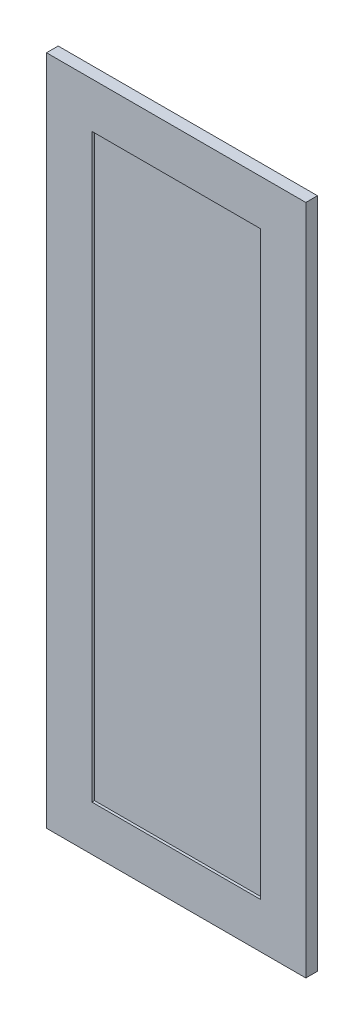
ISO-10303-21;
HEADER;
FILE_DESCRIPTION(('STEP AP214'),'2;1');
FILE_NAME('part.step','',(''),(''),'','','');
FILE_SCHEMA(('AUTOMOTIVE_DESIGN { 1 0 10303 214 1 1 1 1 }'));
ENDSEC;
DATA;
#1=APPLICATION_CONTEXT('core data for automotive mechanical design processes');
#2=APPLICATION_PROTOCOL_DEFINITION('international standard','automotive_design',2000,#1);
#3=PRODUCT_CONTEXT('',#1,'mechanical');
#4=PRODUCT('Part','Part','',(#3));
#5=PRODUCT_RELATED_PRODUCT_CATEGORY('part','',(#4));
#6=PRODUCT_DEFINITION_FORMATION('','',#4);
#7=PRODUCT_DEFINITION_CONTEXT('part definition',#1,'design');
#8=PRODUCT_DEFINITION('design','',#6,#7);
#9=PRODUCT_DEFINITION_SHAPE('','',#8);
#10=(LENGTH_UNIT() NAMED_UNIT(*) SI_UNIT(.MILLI.,.METRE.));
#11=(NAMED_UNIT(*) PLANE_ANGLE_UNIT() SI_UNIT($,.RADIAN.));
#12=(NAMED_UNIT(*) SI_UNIT($,.STERADIAN.) SOLID_ANGLE_UNIT());
#13=UNCERTAINTY_MEASURE_WITH_UNIT(LENGTH_MEASURE(1.E-05),#10,'distance_accuracy_value','');
#14=(GEOMETRIC_REPRESENTATION_CONTEXT(3) GLOBAL_UNCERTAINTY_ASSIGNED_CONTEXT((#13)) GLOBAL_UNIT_ASSIGNED_CONTEXT((#10,
#11,#12)) REPRESENTATION_CONTEXT('',''));
#15=CARTESIAN_POINT('',(0.,0.,0.));
#16=DIRECTION('',(0.,0.,1.));
#17=DIRECTION('',(1.,0.,0.));
#18=AXIS2_PLACEMENT_3D('',#15,#16,#17);
#19=CARTESIAN_POINT('',(200.,518.,18.));
#20=DIRECTION('',(-1.,0.,0.));
#21=DIRECTION('',(0.,-1.,0.));
#22=AXIS2_PLACEMENT_3D('',#19,#20,#21);
#23=PLANE('',#22);
#24=DIRECTION('',(0.,1.,0.));
#25=VECTOR('',#24,1.);
#26=CARTESIAN_POINT('',(200.,518.,0.));
#27=LINE('',#26,#25);
#28=CARTESIAN_POINT('',(200.,-518.,0.));
#29=VERTEX_POINT('',#28);
#30=CARTESIAN_POINT('',(200.,518.,0.));
#31=VERTEX_POINT('',#30);
#32=EDGE_CURVE('E141',#29,#31,#27,.T.);
#33=ORIENTED_EDGE('',*,*,#32,.T.);
#34=DIRECTION('',(0.,0.,-1.));
#35=VECTOR('',#34,1.);
#36=CARTESIAN_POINT('',(200.,518.,18.));
#37=LINE('',#36,#35);
#38=CARTESIAN_POINT('',(200.,518.,18.));
#39=VERTEX_POINT('',#38);
#40=EDGE_CURVE('E11',#39,#31,#37,.T.);
#41=ORIENTED_EDGE('',*,*,#40,.F.);
#42=DIRECTION('',(0.,1.,0.));
#43=VECTOR('',#42,1.);
#44=CARTESIAN_POINT('',(200.,518.,18.));
#45=LINE('',#44,#43);
#46=CARTESIAN_POINT('',(200.,-518.,18.));
#47=VERTEX_POINT('',#46);
#48=EDGE_CURVE('E145',#47,#39,#45,.T.);
#49=ORIENTED_EDGE('',*,*,#48,.F.);
#50=DIRECTION('',(0.,0.,-1.));
#51=VECTOR('',#50,1.);
#52=CARTESIAN_POINT('',(200.,-518.,18.));
#53=LINE('',#52,#51);
#54=EDGE_CURVE('E151',#47,#29,#53,.T.);
#55=ORIENTED_EDGE('',*,*,#54,.T.);
#56=EDGE_LOOP('',(#33,#41,#49,#55));
#57=FACE_BOUND('',#56,.T.);
#58=ADVANCED_FACE('F33',(#57),#23,.F.);
#59=CARTESIAN_POINT('',(-200.,518.,18.));
#60=DIRECTION('',(0.,-1.,0.));
#61=DIRECTION('',(0.,0.,-1.));
#62=AXIS2_PLACEMENT_3D('',#59,#60,#61);
#63=PLANE('',#62);
#64=DIRECTION('',(-1.,0.,0.));
#65=VECTOR('',#64,1.);
#66=CARTESIAN_POINT('',(-200.,518.,0.));
#67=LINE('',#66,#65);
#68=CARTESIAN_POINT('',(-200.,518.,0.));
#69=VERTEX_POINT('',#68);
#70=EDGE_CURVE('E154',#31,#69,#67,.T.);
#71=ORIENTED_EDGE('',*,*,#70,.T.);
#72=DIRECTION('',(0.,0.,-1.));
#73=VECTOR('',#72,1.);
#74=CARTESIAN_POINT('',(-200.,518.,18.));
#75=LINE('',#74,#73);
#76=CARTESIAN_POINT('',(-200.,518.,18.));
#77=VERTEX_POINT('',#76);
#78=EDGE_CURVE('E40',#77,#69,#75,.T.);
#79=ORIENTED_EDGE('',*,*,#78,.F.);
#80=DIRECTION('',(-1.,0.,0.));
#81=VECTOR('',#80,1.);
#82=CARTESIAN_POINT('',(-200.,518.,18.));
#83=LINE('',#82,#81);
#84=EDGE_CURVE('E84',#39,#77,#83,.T.);
#85=ORIENTED_EDGE('',*,*,#84,.F.);
#86=ORIENTED_EDGE('',*,*,#40,.T.);
#87=EDGE_LOOP('',(#71,#79,#85,#86));
#88=FACE_BOUND('',#87,.T.);
#89=ADVANCED_FACE('F183',(#88),#63,.F.);
#90=CARTESIAN_POINT('',(-200.,518.,18.));
#91=DIRECTION('',(1.,0.,0.));
#92=DIRECTION('',(0.,1.,0.));
#93=AXIS2_PLACEMENT_3D('',#90,#91,#92);
#94=PLANE('',#93);
#95=DIRECTION('',(0.,-1.,0.));
#96=VECTOR('',#95,1.);
#97=CARTESIAN_POINT('',(-200.,518.,0.));
#98=LINE('',#97,#96);
#99=CARTESIAN_POINT('',(-200.,-518.,0.));
#100=VERTEX_POINT('',#99);
#101=EDGE_CURVE('E156',#69,#100,#98,.T.);
#102=ORIENTED_EDGE('',*,*,#101,.T.);
#103=DIRECTION('',(0.,0.,-1.));
#104=VECTOR('',#103,1.);
#105=CARTESIAN_POINT('',(-200.,-518.,18.));
#106=LINE('',#105,#104);
#107=CARTESIAN_POINT('',(-200.,-518.,18.));
#108=VERTEX_POINT('',#107);
#109=EDGE_CURVE('E160',#108,#100,#106,.T.);
#110=ORIENTED_EDGE('',*,*,#109,.F.);
#111=DIRECTION('',(0.,-1.,0.));
#112=VECTOR('',#111,1.);
#113=CARTESIAN_POINT('',(-200.,518.,18.));
#114=LINE('',#113,#112);
#115=EDGE_CURVE('E148',#77,#108,#114,.T.);
#116=ORIENTED_EDGE('',*,*,#115,.F.);
#117=ORIENTED_EDGE('',*,*,#78,.T.);
#118=EDGE_LOOP('',(#102,#110,#116,#117));
#119=FACE_BOUND('',#118,.T.);
#120=ADVANCED_FACE('F165',(#119),#94,.F.);
#121=CARTESIAN_POINT('',(-200.,-518.,18.));
#122=DIRECTION('',(0.,1.,0.));
#123=DIRECTION('',(0.,0.,1.));
#124=AXIS2_PLACEMENT_3D('',#121,#122,#123);
#125=PLANE('',#124);
#126=DIRECTION('',(1.,0.,0.));
#127=VECTOR('',#126,1.);
#128=CARTESIAN_POINT('',(-200.,-518.,0.));
#129=LINE('',#128,#127);
#130=EDGE_CURVE('E77',#100,#29,#129,.T.);
#131=ORIENTED_EDGE('',*,*,#130,.T.);
#132=ORIENTED_EDGE('',*,*,#54,.F.);
#133=DIRECTION('',(1.,0.,0.));
#134=VECTOR('',#133,1.);
#135=CARTESIAN_POINT('',(-200.,-518.,18.));
#136=LINE('',#135,#134);
#137=EDGE_CURVE('E56',#108,#47,#136,.T.);
#138=ORIENTED_EDGE('',*,*,#137,.F.);
#139=ORIENTED_EDGE('',*,*,#109,.T.);
#140=EDGE_LOOP('',(#131,#132,#138,#139));
#141=FACE_BOUND('',#140,.T.);
#142=ADVANCED_FACE('F173',(#141),#125,.F.);
#143=CARTESIAN_POINT('',(0.,0.,18.));
#144=DIRECTION('',(0.,0.,1.));
#145=DIRECTION('',(1.,0.,0.));
#146=AXIS2_PLACEMENT_3D('',#143,#144,#145);
#147=PLANE('',#146);
#148=DIRECTION('',(0.,1.,0.));
#149=VECTOR('',#148,1.);
#150=CARTESIAN_POINT('',(130.,448.,18.));
#151=LINE('',#150,#149);
#152=CARTESIAN_POINT('',(130.,-448.,18.));
#153=VERTEX_POINT('',#152);
#154=CARTESIAN_POINT('',(130.,448.,18.));
#155=VERTEX_POINT('',#154);
#156=EDGE_CURVE('E47',#153,#155,#151,.T.);
#157=ORIENTED_EDGE('',*,*,#156,.F.);
#158=DIRECTION('',(1.,0.,0.));
#159=VECTOR('',#158,1.);
#160=CARTESIAN_POINT('',(-130.,-448.,18.));
#161=LINE('',#160,#159);
#162=CARTESIAN_POINT('',(-130.,-448.,18.));
#163=VERTEX_POINT('',#162);
#164=EDGE_CURVE('E126',#163,#153,#161,.T.);
#165=ORIENTED_EDGE('',*,*,#164,.F.);
#166=DIRECTION('',(0.,-1.,0.));
#167=VECTOR('',#166,1.);
#168=CARTESIAN_POINT('',(-130.,448.,18.));
#169=LINE('',#168,#167);
#170=CARTESIAN_POINT('',(-130.,448.,18.));
#171=VERTEX_POINT('',#170);
#172=EDGE_CURVE('E129',#171,#163,#169,.T.);
#173=ORIENTED_EDGE('',*,*,#172,.F.);
#174=DIRECTION('',(-1.,0.,0.));
#175=VECTOR('',#174,1.);
#176=CARTESIAN_POINT('',(-130.,448.,18.));
#177=LINE('',#176,#175);
#178=EDGE_CURVE('E135',#155,#171,#177,.T.);
#179=ORIENTED_EDGE('',*,*,#178,.F.);
#180=EDGE_LOOP('',(#157,#165,#173,#179));
#181=FACE_BOUND('',#180,.T.);
#182=ORIENTED_EDGE('',*,*,#48,.T.);
#183=ORIENTED_EDGE('',*,*,#84,.T.);
#184=ORIENTED_EDGE('',*,*,#115,.T.);
#185=ORIENTED_EDGE('',*,*,#137,.T.);
#186=EDGE_LOOP('',(#182,#183,#184,#185));
#187=FACE_BOUND('',#186,.T.);
#188=ADVANCED_FACE('F175',(#181,#187),#147,.T.);
#189=CARTESIAN_POINT('',(0.,0.,0.));
#190=DIRECTION('',(0.,0.,1.));
#191=DIRECTION('',(1.,0.,0.));
#192=AXIS2_PLACEMENT_3D('',#189,#190,#191);
#193=PLANE('',#192);
#194=ORIENTED_EDGE('',*,*,#32,.F.);
#195=ORIENTED_EDGE('',*,*,#130,.F.);
#196=ORIENTED_EDGE('',*,*,#101,.F.);
#197=ORIENTED_EDGE('',*,*,#70,.F.);
#198=EDGE_LOOP('',(#194,#195,#196,#197));
#199=FACE_BOUND('',#198,.T.);
#200=ADVANCED_FACE('F169',(#199),#193,.F.);
#201=CARTESIAN_POINT('',(130.,448.,14.));
#202=DIRECTION('',(1.,0.,0.));
#203=DIRECTION('',(0.,0.,-1.));
#204=AXIS2_PLACEMENT_3D('',#201,#202,#203);
#205=PLANE('',#204);
#206=ORIENTED_EDGE('',*,*,#156,.T.);
#207=DIRECTION('',(0.,0.,1.));
#208=VECTOR('',#207,1.);
#209=CARTESIAN_POINT('',(130.,448.,14.));
#210=LINE('',#209,#208);
#211=CARTESIAN_POINT('',(130.,448.,14.));
#212=VERTEX_POINT('',#211);
#213=EDGE_CURVE('E104',#212,#155,#210,.T.);
#214=ORIENTED_EDGE('',*,*,#213,.F.);
#215=DIRECTION('',(0.,1.,0.));
#216=VECTOR('',#215,1.);
#217=CARTESIAN_POINT('',(130.,448.,14.));
#218=LINE('',#217,#216);
#219=CARTESIAN_POINT('',(130.,-448.,14.));
#220=VERTEX_POINT('',#219);
#221=EDGE_CURVE('E108',#220,#212,#218,.T.);
#222=ORIENTED_EDGE('',*,*,#221,.F.);
#223=DIRECTION('',(0.,0.,1.));
#224=VECTOR('',#223,1.);
#225=CARTESIAN_POINT('',(130.,-448.,14.));
#226=LINE('',#225,#224);
#227=EDGE_CURVE('E139',#220,#153,#226,.T.);
#228=ORIENTED_EDGE('',*,*,#227,.T.);
#229=EDGE_LOOP('',(#206,#214,#222,#228));
#230=FACE_BOUND('',#229,.T.);
#231=ADVANCED_FACE('F106',(#230),#205,.F.);
#232=CARTESIAN_POINT('',(-130.,-448.,14.));
#233=DIRECTION('',(0.,-1.,0.));
#234=DIRECTION('',(0.,0.,-1.));
#235=AXIS2_PLACEMENT_3D('',#232,#233,#234);
#236=PLANE('',#235);
#237=ORIENTED_EDGE('',*,*,#164,.T.);
#238=ORIENTED_EDGE('',*,*,#227,.F.);
#239=DIRECTION('',(1.,0.,0.));
#240=VECTOR('',#239,1.);
#241=CARTESIAN_POINT('',(-130.,-448.,14.));
#242=LINE('',#241,#240);
#243=CARTESIAN_POINT('',(-130.,-448.,14.));
#244=VERTEX_POINT('',#243);
#245=EDGE_CURVE('E114',#244,#220,#242,.T.);
#246=ORIENTED_EDGE('',*,*,#245,.F.);
#247=DIRECTION('',(0.,0.,1.));
#248=VECTOR('',#247,1.);
#249=CARTESIAN_POINT('',(-130.,-448.,14.));
#250=LINE('',#249,#248);
#251=EDGE_CURVE('E142',#244,#163,#250,.T.);
#252=ORIENTED_EDGE('',*,*,#251,.T.);
#253=EDGE_LOOP('',(#237,#238,#246,#252));
#254=FACE_BOUND('',#253,.T.);
#255=ADVANCED_FACE('F222',(#254),#236,.F.);
#256=CARTESIAN_POINT('',(-130.,448.,14.));
#257=DIRECTION('',(-1.,0.,0.));
#258=DIRECTION('',(0.,0.,1.));
#259=AXIS2_PLACEMENT_3D('',#256,#257,#258);
#260=PLANE('',#259);
#261=ORIENTED_EDGE('',*,*,#172,.T.);
#262=ORIENTED_EDGE('',*,*,#251,.F.);
#263=DIRECTION('',(0.,-1.,0.));
#264=VECTOR('',#263,1.);
#265=CARTESIAN_POINT('',(-130.,448.,14.));
#266=LINE('',#265,#264);
#267=CARTESIAN_POINT('',(-130.,448.,14.));
#268=VERTEX_POINT('',#267);
#269=EDGE_CURVE('E122',#268,#244,#266,.T.);
#270=ORIENTED_EDGE('',*,*,#269,.F.);
#271=DIRECTION('',(0.,0.,1.));
#272=VECTOR('',#271,1.);
#273=CARTESIAN_POINT('',(-130.,448.,14.));
#274=LINE('',#273,#272);
#275=EDGE_CURVE('E113',#268,#171,#274,.T.);
#276=ORIENTED_EDGE('',*,*,#275,.T.);
#277=EDGE_LOOP('',(#261,#262,#270,#276));
#278=FACE_BOUND('',#277,.T.);
#279=ADVANCED_FACE('F231',(#278),#260,.F.);
#280=CARTESIAN_POINT('',(-130.,448.,14.));
#281=DIRECTION('',(0.,1.,0.));
#282=DIRECTION('',(0.,0.,1.));
#283=AXIS2_PLACEMENT_3D('',#280,#281,#282);
#284=PLANE('',#283);
#285=ORIENTED_EDGE('',*,*,#178,.T.);
#286=ORIENTED_EDGE('',*,*,#275,.F.);
#287=DIRECTION('',(-1.,0.,0.));
#288=VECTOR('',#287,1.);
#289=CARTESIAN_POINT('',(-130.,448.,14.));
#290=LINE('',#289,#288);
#291=EDGE_CURVE('E117',#212,#268,#290,.T.);
#292=ORIENTED_EDGE('',*,*,#291,.F.);
#293=ORIENTED_EDGE('',*,*,#213,.T.);
#294=EDGE_LOOP('',(#285,#286,#292,#293));
#295=FACE_BOUND('',#294,.T.);
#296=ADVANCED_FACE('F118',(#295),#284,.F.);
#297=CARTESIAN_POINT('',(0.,0.,14.));
#298=DIRECTION('',(0.,0.,1.));
#299=DIRECTION('',(1.,0.,0.));
#300=AXIS2_PLACEMENT_3D('',#297,#298,#299);
#301=PLANE('',#300);
#302=ORIENTED_EDGE('',*,*,#221,.T.);
#303=ORIENTED_EDGE('',*,*,#291,.T.);
#304=ORIENTED_EDGE('',*,*,#269,.T.);
#305=ORIENTED_EDGE('',*,*,#245,.T.);
#306=EDGE_LOOP('',(#302,#303,#304,#305));
#307=FACE_BOUND('',#306,.T.);
#308=ADVANCED_FACE('F124',(#307),#301,.T.);
#309=CLOSED_SHELL('',(#58,#89,#120,#142,#188,#200,#231,#255,#279,#296,#308));
#310=MANIFOLD_SOLID_BREP('B2',#309);
#311=ADVANCED_BREP_SHAPE_REPRESENTATION('',(#18,#310),#14);
#312=SHAPE_DEFINITION_REPRESENTATION(#9,#311);
ENDSEC;
END-ISO-10303-21;
